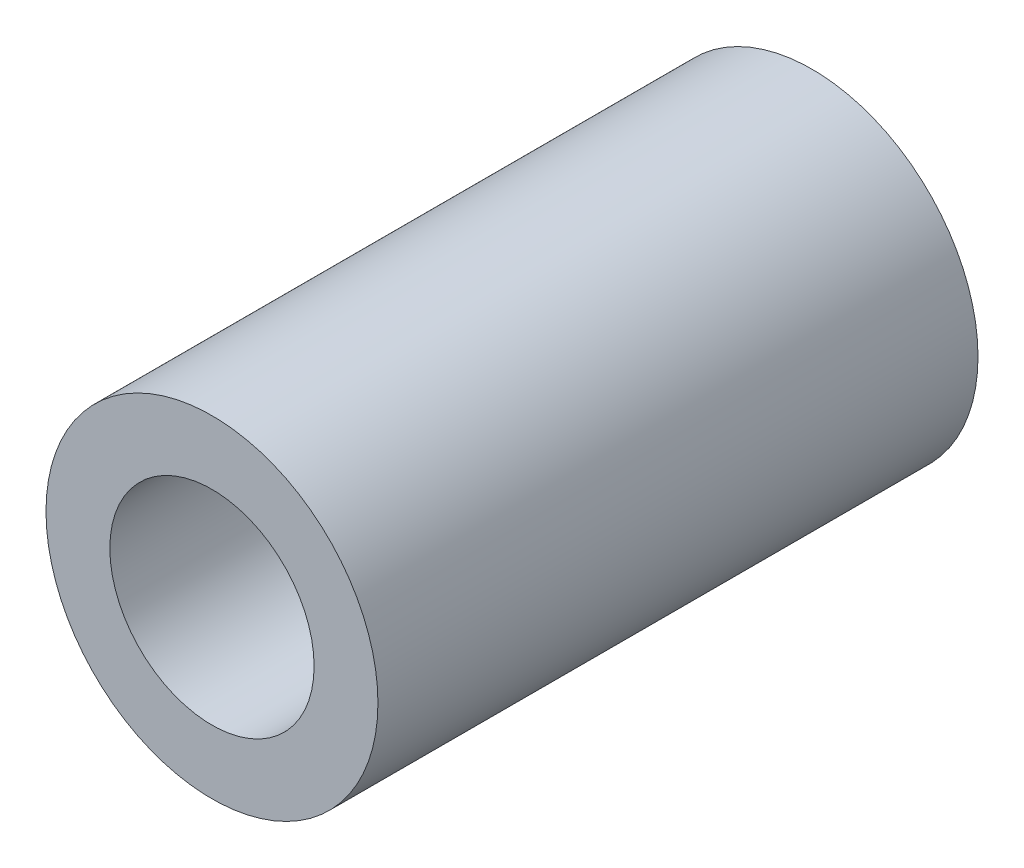
ISO-10303-21;
HEADER;
FILE_DESCRIPTION(('STEP AP214'),'2;1');
FILE_NAME('part.step','',(''),(''),'','','');
FILE_SCHEMA(('AUTOMOTIVE_DESIGN { 1 0 10303 214 1 1 1 1 }'));
ENDSEC;
DATA;
#1=APPLICATION_CONTEXT('core data for automotive mechanical design processes');
#2=APPLICATION_PROTOCOL_DEFINITION('international standard','automotive_design',2000,#1);
#3=PRODUCT_CONTEXT('',#1,'mechanical');
#4=PRODUCT('Part','Part','',(#3));
#5=PRODUCT_RELATED_PRODUCT_CATEGORY('part','',(#4));
#6=PRODUCT_DEFINITION_FORMATION('','',#4);
#7=PRODUCT_DEFINITION_CONTEXT('part definition',#1,'design');
#8=PRODUCT_DEFINITION('design','',#6,#7);
#9=PRODUCT_DEFINITION_SHAPE('','',#8);
#10=(LENGTH_UNIT() NAMED_UNIT(*) SI_UNIT(.MILLI.,.METRE.));
#11=(NAMED_UNIT(*) PLANE_ANGLE_UNIT() SI_UNIT($,.RADIAN.));
#12=(NAMED_UNIT(*) SI_UNIT($,.STERADIAN.) SOLID_ANGLE_UNIT());
#13=UNCERTAINTY_MEASURE_WITH_UNIT(LENGTH_MEASURE(1.E-05),#10,'distance_accuracy_value','');
#14=(GEOMETRIC_REPRESENTATION_CONTEXT(3) GLOBAL_UNCERTAINTY_ASSIGNED_CONTEXT((#13)) GLOBAL_UNIT_ASSIGNED_CONTEXT((#10,
#11,#12)) REPRESENTATION_CONTEXT('',''));
#15=CARTESIAN_POINT('',(0.,0.,0.));
#16=DIRECTION('',(0.,0.,1.));
#17=DIRECTION('',(1.,0.,0.));
#18=AXIS2_PLACEMENT_3D('',#15,#16,#17);
#19=CARTESIAN_POINT('',(10.,-10.,24.));
#20=DIRECTION('',(0.,0.,1.));
#21=DIRECTION('',(1.,0.,0.));
#22=AXIS2_PLACEMENT_3D('',#19,#20,#21);
#23=PLANE('',#22);
#24=CARTESIAN_POINT('',(10.,-10.,24.));
#25=DIRECTION('',(0.,0.,1.));
#26=DIRECTION('',(1.,0.,0.));
#27=AXIS2_PLACEMENT_3D('',#24,#25,#26);
#28=CIRCLE('',#27,1.6);
#29=CARTESIAN_POINT('',(11.6,-10.,24.));
#30=VERTEX_POINT('',#29);
#31=EDGE_CURVE('E23',#30,#30,#28,.T.);
#32=ORIENTED_EDGE('',*,*,#31,.F.);
#33=EDGE_LOOP('',(#32));
#34=FACE_BOUND('',#33,.T.);
#35=CARTESIAN_POINT('',(10.,-10.,24.));
#36=DIRECTION('',(0.,0.,1.));
#37=DIRECTION('',(1.,0.,0.));
#38=AXIS2_PLACEMENT_3D('',#35,#36,#37);
#39=CIRCLE('',#38,2.6);
#40=CARTESIAN_POINT('',(12.6,-10.,24.));
#41=VERTEX_POINT('',#40);
#42=EDGE_CURVE('E57',#41,#41,#39,.T.);
#43=ORIENTED_EDGE('',*,*,#42,.T.);
#44=EDGE_LOOP('',(#43));
#45=FACE_BOUND('',#44,.T.);
#46=ADVANCED_FACE('F15',(#34,#45),#23,.T.);
#47=CARTESIAN_POINT('',(10.,-10.,14.6));
#48=DIRECTION('',(0.,0.,1.));
#49=DIRECTION('',(1.,0.,0.));
#50=AXIS2_PLACEMENT_3D('',#47,#48,#49);
#51=PLANE('',#50);
#52=CARTESIAN_POINT('',(10.,-10.,14.6));
#53=DIRECTION('',(0.,0.,1.));
#54=DIRECTION('',(1.,0.,0.));
#55=AXIS2_PLACEMENT_3D('',#52,#53,#54);
#56=CIRCLE('',#55,1.6);
#57=CARTESIAN_POINT('',(11.6,-10.,14.6));
#58=VERTEX_POINT('',#57);
#59=EDGE_CURVE('E9',#58,#58,#56,.T.);
#60=ORIENTED_EDGE('',*,*,#59,.T.);
#61=EDGE_LOOP('',(#60));
#62=FACE_BOUND('',#61,.T.);
#63=CARTESIAN_POINT('',(10.,-10.,14.6));
#64=DIRECTION('',(0.,0.,1.));
#65=DIRECTION('',(1.,0.,0.));
#66=AXIS2_PLACEMENT_3D('',#63,#64,#65);
#67=CIRCLE('',#66,2.6);
#68=CARTESIAN_POINT('',(12.6,-10.,14.6));
#69=VERTEX_POINT('',#68);
#70=EDGE_CURVE('E54',#69,#69,#67,.T.);
#71=ORIENTED_EDGE('',*,*,#70,.F.);
#72=EDGE_LOOP('',(#71));
#73=FACE_BOUND('',#72,.T.);
#74=ADVANCED_FACE('F74',(#62,#73),#51,.F.);
#75=CARTESIAN_POINT('',(10.,-10.,14.6));
#76=DIRECTION('',(0.,0.,-1.));
#77=DIRECTION('',(1.,0.,0.));
#78=AXIS2_PLACEMENT_3D('',#75,#76,#77);
#79=CYLINDRICAL_SURFACE('',#78,1.6);
#80=DIRECTION('',(0.,0.,1.));
#81=VECTOR('',#80,1.);
#82=CARTESIAN_POINT('',(11.6,-10.,14.6));
#83=LINE('',#82,#81);
#84=EDGE_CURVE('E62',#58,#30,#83,.T.);
#85=ORIENTED_EDGE('',*,*,#84,.T.);
#86=ORIENTED_EDGE('',*,*,#31,.T.);
#87=ORIENTED_EDGE('',*,*,#84,.F.);
#88=ORIENTED_EDGE('',*,*,#59,.F.);
#89=EDGE_LOOP('',(#85,#86,#87,#88));
#90=FACE_BOUND('',#89,.T.);
#91=ADVANCED_FACE('F73',(#90),#79,.F.);
#92=CARTESIAN_POINT('',(10.,-10.,14.6));
#93=DIRECTION('',(0.,0.,-1.));
#94=DIRECTION('',(1.,0.,0.));
#95=AXIS2_PLACEMENT_3D('',#92,#93,#94);
#96=CYLINDRICAL_SURFACE('',#95,2.6);
#97=ORIENTED_EDGE('',*,*,#70,.T.);
#98=DIRECTION('',(0.,0.,1.));
#99=VECTOR('',#98,1.);
#100=CARTESIAN_POINT('',(12.6,-10.,14.6));
#101=LINE('',#100,#99);
#102=EDGE_CURVE('E55',#69,#41,#101,.T.);
#103=ORIENTED_EDGE('',*,*,#102,.T.);
#104=ORIENTED_EDGE('',*,*,#42,.F.);
#105=ORIENTED_EDGE('',*,*,#102,.F.);
#106=EDGE_LOOP('',(#97,#103,#104,#105));
#107=FACE_BOUND('',#106,.T.);
#108=ADVANCED_FACE('F52',(#107),#96,.T.);
#109=CLOSED_SHELL('',(#46,#74,#91,#108));
#110=MANIFOLD_SOLID_BREP('B1',#109);
#111=ADVANCED_BREP_SHAPE_REPRESENTATION('',(#18,#110),#14);
#112=SHAPE_DEFINITION_REPRESENTATION(#9,#111);
ENDSEC;
END-ISO-10303-21;
